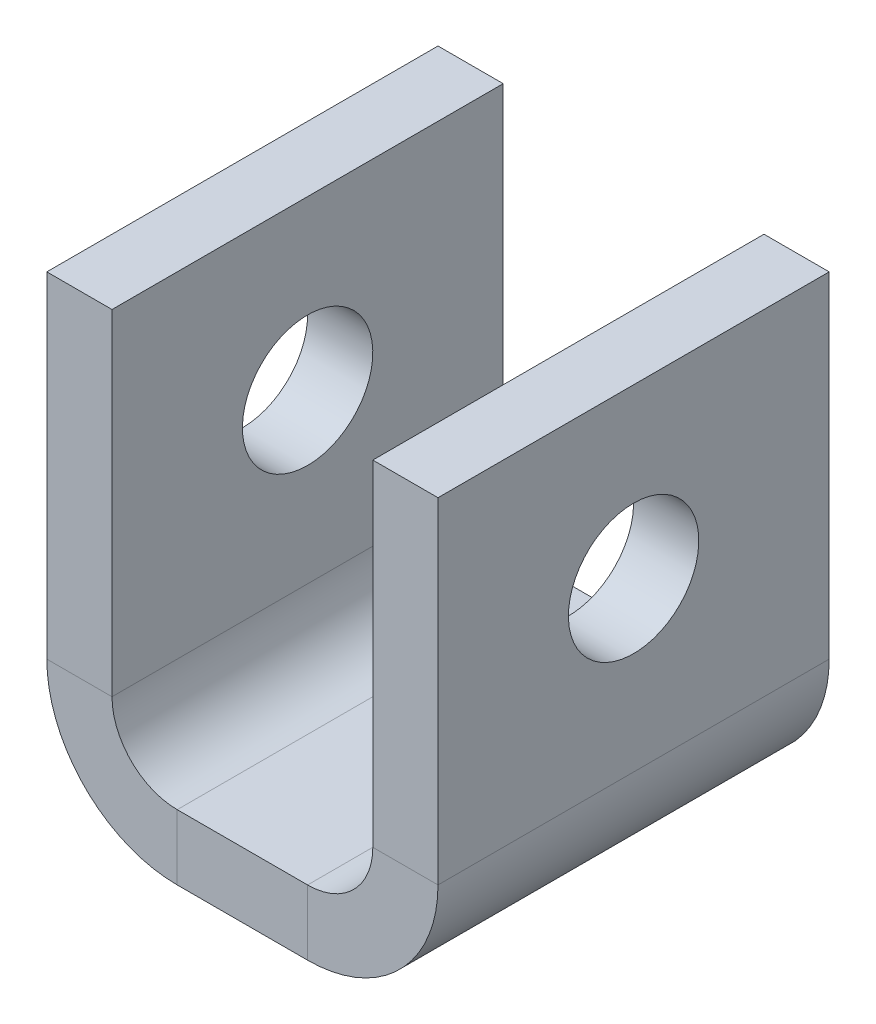
ISO-10303-21;
HEADER;
FILE_DESCRIPTION(('STEP AP214'),'2;1');
FILE_NAME('part.step','',(''),(''),'','','');
FILE_SCHEMA(('AUTOMOTIVE_DESIGN { 1 0 10303 214 1 1 1 1 }'));
ENDSEC;
DATA;
#1=APPLICATION_CONTEXT('core data for automotive mechanical design processes');
#2=APPLICATION_PROTOCOL_DEFINITION('international standard','automotive_design',2000,#1);
#3=PRODUCT_CONTEXT('',#1,'mechanical');
#4=PRODUCT('Part','Part','',(#3));
#5=PRODUCT_RELATED_PRODUCT_CATEGORY('part','',(#4));
#6=PRODUCT_DEFINITION_FORMATION('','',#4);
#7=PRODUCT_DEFINITION_CONTEXT('part definition',#1,'design');
#8=PRODUCT_DEFINITION('design','',#6,#7);
#9=PRODUCT_DEFINITION_SHAPE('','',#8);
#10=(LENGTH_UNIT() NAMED_UNIT(*) SI_UNIT(.MILLI.,.METRE.));
#11=(NAMED_UNIT(*) PLANE_ANGLE_UNIT() SI_UNIT($,.RADIAN.));
#12=(NAMED_UNIT(*) SI_UNIT($,.STERADIAN.) SOLID_ANGLE_UNIT());
#13=UNCERTAINTY_MEASURE_WITH_UNIT(LENGTH_MEASURE(1.E-05),#10,'distance_accuracy_value','');
#14=(GEOMETRIC_REPRESENTATION_CONTEXT(3) GLOBAL_UNCERTAINTY_ASSIGNED_CONTEXT((#13)) GLOBAL_UNIT_ASSIGNED_CONTEXT((#10,
#11,#12)) REPRESENTATION_CONTEXT('',''));
#15=CARTESIAN_POINT('',(0.,0.,0.));
#16=DIRECTION('',(0.,0.,1.));
#17=DIRECTION('',(1.,0.,0.));
#18=AXIS2_PLACEMENT_3D('',#15,#16,#17);
#19=CARTESIAN_POINT('',(0.,-5.,0.));
#20=DIRECTION('',(0.,-1.,0.));
#21=DIRECTION('',(0.,0.,-1.));
#22=AXIS2_PLACEMENT_3D('',#19,#20,#21);
#23=PLANE('',#22);
#24=CARTESIAN_POINT('',(0.,-5.,0.));
#25=DIRECTION('',(0.,-1.,0.));
#26=DIRECTION('',(0.,0.,-1.));
#27=AXIS2_PLACEMENT_3D('',#24,#25,#26);
#28=CIRCLE('',#27,2.5);
#29=CARTESIAN_POINT('',(0.,-5.,-2.5));
#30=VERTEX_POINT('',#29);
#31=EDGE_CURVE('E370',#30,#30,#28,.T.);
#32=ORIENTED_EDGE('',*,*,#31,.F.);
#33=EDGE_LOOP('',(#32));
#34=FACE_BOUND('',#33,.T.);
#35=DIRECTION('',(-1.,0.,0.));
#36=VECTOR('',#35,1.);
#37=CARTESIAN_POINT('',(-42.5,-5.,-15.));
#38=LINE('',#37,#36);
#39=CARTESIAN_POINT('',(5.00000000000002,-5.,-15.));
#40=VERTEX_POINT('',#39);
#41=CARTESIAN_POINT('',(-4.99999999999999,-5.,-15.));
#42=VERTEX_POINT('',#41);
#43=EDGE_CURVE('E254',#40,#42,#38,.T.);
#44=ORIENTED_EDGE('',*,*,#43,.F.);
#45=DIRECTION('',(0.,0.,1.));
#46=VECTOR('',#45,1.);
#47=CARTESIAN_POINT('',(5.00000000000002,-5.,0.));
#48=LINE('',#47,#46);
#49=CARTESIAN_POINT('',(5.00000000000002,-5.,15.));
#50=VERTEX_POINT('',#49);
#51=EDGE_CURVE('E245',#40,#50,#48,.T.);
#52=ORIENTED_EDGE('',*,*,#51,.T.);
#53=DIRECTION('',(1.,0.,0.));
#54=VECTOR('',#53,1.);
#55=CARTESIAN_POINT('',(-42.5,-5.,15.));
#56=LINE('',#55,#54);
#57=CARTESIAN_POINT('',(-4.99999999999999,-5.,15.));
#58=VERTEX_POINT('',#57);
#59=EDGE_CURVE('E237',#58,#50,#56,.T.);
#60=ORIENTED_EDGE('',*,*,#59,.F.);
#61=DIRECTION('',(0.,0.,1.));
#62=VECTOR('',#61,1.);
#63=CARTESIAN_POINT('',(-4.99999999999999,-5.,0.));
#64=LINE('',#63,#62);
#65=EDGE_CURVE('E233',#42,#58,#64,.T.);
#66=ORIENTED_EDGE('',*,*,#65,.F.);
#67=EDGE_LOOP('',(#44,#52,#60,#66));
#68=FACE_BOUND('',#67,.T.);
#69=ADVANCED_FACE('F53',(#34,#68),#23,.T.);
#70=CARTESIAN_POINT('',(-42.5,-5.,-15.));
#71=DIRECTION('',(0.,0.,-1.));
#72=DIRECTION('',(-1.,0.,0.));
#73=AXIS2_PLACEMENT_3D('',#70,#71,#72);
#74=PLANE('',#73);
#75=DIRECTION('',(-1.,0.,0.));
#76=VECTOR('',#75,1.);
#77=CARTESIAN_POINT('',(-42.5,0.,-15.));
#78=LINE('',#77,#76);
#79=CARTESIAN_POINT('',(5.00000000000001,0.,-15.));
#80=VERTEX_POINT('',#79);
#81=CARTESIAN_POINT('',(-4.99999999999999,0.,-15.));
#82=VERTEX_POINT('',#81);
#83=EDGE_CURVE('E76',#80,#82,#78,.T.);
#84=ORIENTED_EDGE('',*,*,#83,.F.);
#85=DIRECTION('',(0.,-1.,0.));
#86=VECTOR('',#85,1.);
#87=CARTESIAN_POINT('',(5.00000000000001,-5.,-15.));
#88=LINE('',#87,#86);
#89=EDGE_CURVE('E248',#80,#40,#88,.T.);
#90=ORIENTED_EDGE('',*,*,#89,.T.);
#91=ORIENTED_EDGE('',*,*,#43,.T.);
#92=DIRECTION('',(0.,-1.,0.));
#93=VECTOR('',#92,1.);
#94=CARTESIAN_POINT('',(-5.,-5.,-15.));
#95=LINE('',#94,#93);
#96=EDGE_CURVE('E242',#82,#42,#95,.T.);
#97=ORIENTED_EDGE('',*,*,#96,.F.);
#98=EDGE_LOOP('',(#84,#90,#91,#97));
#99=FACE_BOUND('',#98,.T.);
#100=ADVANCED_FACE('F297',(#99),#74,.T.);
#101=CARTESIAN_POINT('',(-42.5,-5.,15.));
#102=DIRECTION('',(0.,0.,1.));
#103=DIRECTION('',(1.,0.,0.));
#104=AXIS2_PLACEMENT_3D('',#101,#102,#103);
#105=PLANE('',#104);
#106=ORIENTED_EDGE('',*,*,#59,.T.);
#107=DIRECTION('',(0.,1.,0.));
#108=VECTOR('',#107,1.);
#109=CARTESIAN_POINT('',(5.00000000000002,-5.,15.));
#110=LINE('',#109,#108);
#111=CARTESIAN_POINT('',(5.00000000000002,0.,15.));
#112=VERTEX_POINT('',#111);
#113=EDGE_CURVE('E12',#50,#112,#110,.T.);
#114=ORIENTED_EDGE('',*,*,#113,.T.);
#115=DIRECTION('',(1.,0.,0.));
#116=VECTOR('',#115,1.);
#117=CARTESIAN_POINT('',(-42.5,0.,15.));
#118=LINE('',#117,#116);
#119=CARTESIAN_POINT('',(-4.99999999999999,0.,15.));
#120=VERTEX_POINT('',#119);
#121=EDGE_CURVE('E255',#120,#112,#118,.T.);
#122=ORIENTED_EDGE('',*,*,#121,.F.);
#123=DIRECTION('',(0.,1.,0.));
#124=VECTOR('',#123,1.);
#125=CARTESIAN_POINT('',(-4.99999999999999,-5.,15.));
#126=LINE('',#125,#124);
#127=EDGE_CURVE('E236',#58,#120,#126,.T.);
#128=ORIENTED_EDGE('',*,*,#127,.F.);
#129=EDGE_LOOP('',(#106,#114,#122,#128));
#130=FACE_BOUND('',#129,.T.);
#131=ADVANCED_FACE('F55',(#130),#105,.T.);
#132=CARTESIAN_POINT('',(0.,0.,0.));
#133=DIRECTION('',(0.,-1.,0.));
#134=DIRECTION('',(0.,0.,-1.));
#135=AXIS2_PLACEMENT_3D('',#132,#133,#134);
#136=PLANE('',#135);
#137=CARTESIAN_POINT('',(0.,0.,0.));
#138=DIRECTION('',(0.,-1.,0.));
#139=DIRECTION('',(0.,0.,-1.));
#140=AXIS2_PLACEMENT_3D('',#137,#138,#139);
#141=CIRCLE('',#140,2.5);
#142=CARTESIAN_POINT('',(0.,0.,-2.5));
#143=VERTEX_POINT('',#142);
#144=EDGE_CURVE('E57',#143,#143,#141,.T.);
#145=ORIENTED_EDGE('',*,*,#144,.T.);
#146=EDGE_LOOP('',(#145));
#147=FACE_BOUND('',#146,.T.);
#148=DIRECTION('',(0.,0.,1.));
#149=VECTOR('',#148,1.);
#150=CARTESIAN_POINT('',(5.00000000000002,0.,0.));
#151=LINE('',#150,#149);
#152=EDGE_CURVE('E62',#80,#112,#151,.T.);
#153=ORIENTED_EDGE('',*,*,#152,.F.);
#154=ORIENTED_EDGE('',*,*,#83,.T.);
#155=DIRECTION('',(0.,0.,1.));
#156=VECTOR('',#155,1.);
#157=CARTESIAN_POINT('',(-4.99999999999999,0.,0.));
#158=LINE('',#157,#156);
#159=EDGE_CURVE('E240',#82,#120,#158,.T.);
#160=ORIENTED_EDGE('',*,*,#159,.T.);
#161=ORIENTED_EDGE('',*,*,#121,.T.);
#162=EDGE_LOOP('',(#153,#154,#160,#161));
#163=FACE_BOUND('',#162,.T.);
#164=ADVANCED_FACE('F360',(#147,#163),#136,.F.);
#165=CARTESIAN_POINT('',(-5.,5.,-15.));
#166=DIRECTION('',(0.,0.,-1.));
#167=DIRECTION('',(-1.,0.,0.));
#168=AXIS2_PLACEMENT_3D('',#165,#166,#167);
#169=PLANE('',#168);
#170=DIRECTION('',(-1.,0.,0.));
#171=VECTOR('',#170,1.);
#172=CARTESIAN_POINT('',(-15.,5.00000000000003,-15.));
#173=LINE('',#172,#171);
#174=CARTESIAN_POINT('',(-9.99999999999999,5.00000000000001,-15.));
#175=VERTEX_POINT('',#174);
#176=CARTESIAN_POINT('',(-15.,5.00000000000004,-15.));
#177=VERTEX_POINT('',#176);
#178=EDGE_CURVE('E198',#175,#177,#173,.T.);
#179=ORIENTED_EDGE('',*,*,#178,.F.);
#180=CARTESIAN_POINT('',(-5.,5.,-15.));
#181=DIRECTION('',(0.,0.,-1.));
#182=DIRECTION('',(-1.,0.,0.));
#183=AXIS2_PLACEMENT_3D('',#180,#181,#182);
#184=CIRCLE('',#183,5.);
#185=EDGE_CURVE('E195',#175,#82,#184,.F.);
#186=ORIENTED_EDGE('',*,*,#185,.T.);
#187=ORIENTED_EDGE('',*,*,#96,.T.);
#188=CARTESIAN_POINT('',(-5.,5.,-15.));
#189=DIRECTION('',(0.,0.,1.));
#190=DIRECTION('',(-1.,0.,0.));
#191=AXIS2_PLACEMENT_3D('',#188,#189,#190);
#192=CIRCLE('',#191,10.);
#193=EDGE_CURVE('E222',#177,#42,#192,.T.);
#194=ORIENTED_EDGE('',*,*,#193,.F.);
#195=EDGE_LOOP('',(#179,#186,#187,#194));
#196=FACE_BOUND('',#195,.T.);
#197=ADVANCED_FACE('F327',(#196),#169,.T.);
#198=CARTESIAN_POINT('',(-4.99999999999999,5.,15.));
#199=DIRECTION('',(0.,0.,1.));
#200=DIRECTION('',(1.,0.,0.));
#201=AXIS2_PLACEMENT_3D('',#198,#199,#200);
#202=PLANE('',#201);
#203=CARTESIAN_POINT('',(-4.99999999999999,5.,15.));
#204=DIRECTION('',(0.,0.,-1.));
#205=DIRECTION('',(-1.,0.,0.));
#206=AXIS2_PLACEMENT_3D('',#203,#204,#205);
#207=CIRCLE('',#206,5.);
#208=CARTESIAN_POINT('',(-9.99999999999999,5.00000000000002,15.));
#209=VERTEX_POINT('',#208);
#210=EDGE_CURVE('E226',#120,#209,#207,.T.);
#211=ORIENTED_EDGE('',*,*,#210,.T.);
#212=DIRECTION('',(1.,0.,0.));
#213=VECTOR('',#212,1.);
#214=CARTESIAN_POINT('',(-15.,5.00000000000003,15.));
#215=LINE('',#214,#213);
#216=CARTESIAN_POINT('',(-15.,5.00000000000003,15.));
#217=VERTEX_POINT('',#216);
#218=EDGE_CURVE('E207',#217,#209,#215,.T.);
#219=ORIENTED_EDGE('',*,*,#218,.F.);
#220=CARTESIAN_POINT('',(-4.99999999999999,5.,15.));
#221=DIRECTION('',(0.,0.,-1.));
#222=DIRECTION('',(1.,0.,0.));
#223=AXIS2_PLACEMENT_3D('',#220,#221,#222);
#224=CIRCLE('',#223,10.);
#225=EDGE_CURVE('E225',#58,#217,#224,.T.);
#226=ORIENTED_EDGE('',*,*,#225,.F.);
#227=ORIENTED_EDGE('',*,*,#127,.T.);
#228=EDGE_LOOP('',(#211,#219,#226,#227));
#229=FACE_BOUND('',#228,.T.);
#230=ADVANCED_FACE('F313',(#229),#202,.T.);
#231=CARTESIAN_POINT('',(-4.99999999999999,5.,32.6158138314886));
#232=DIRECTION('',(0.,0.,-1.));
#233=DIRECTION('',(-1.,0.,0.));
#234=AXIS2_PLACEMENT_3D('',#231,#232,#233);
#235=CYLINDRICAL_SURFACE('',#234,10.);
#236=ORIENTED_EDGE('',*,*,#65,.T.);
#237=ORIENTED_EDGE('',*,*,#225,.T.);
#238=DIRECTION('',(0.,0.,1.));
#239=VECTOR('',#238,1.);
#240=CARTESIAN_POINT('',(-15.,5.00000000000003,0.));
#241=LINE('',#240,#239);
#242=EDGE_CURVE('E213',#177,#217,#241,.T.);
#243=ORIENTED_EDGE('',*,*,#242,.F.);
#244=ORIENTED_EDGE('',*,*,#193,.T.);
#245=EDGE_LOOP('',(#236,#237,#243,#244));
#246=FACE_BOUND('',#245,.T.);
#247=ADVANCED_FACE('F309',(#246),#235,.T.);
#248=CARTESIAN_POINT('',(-4.99999999999999,5.,32.6158138314886));
#249=DIRECTION('',(0.,0.,-1.));
#250=DIRECTION('',(-1.,0.,0.));
#251=AXIS2_PLACEMENT_3D('',#248,#249,#250);
#252=CYLINDRICAL_SURFACE('',#251,5.);
#253=ORIENTED_EDGE('',*,*,#159,.F.);
#254=ORIENTED_EDGE('',*,*,#185,.F.);
#255=DIRECTION('',(0.,0.,1.));
#256=VECTOR('',#255,1.);
#257=CARTESIAN_POINT('',(-9.99999999999999,5.00000000000002,0.));
#258=LINE('',#257,#256);
#259=EDGE_CURVE('E188',#175,#209,#258,.T.);
#260=ORIENTED_EDGE('',*,*,#259,.T.);
#261=ORIENTED_EDGE('',*,*,#210,.F.);
#262=EDGE_LOOP('',(#253,#254,#260,#261));
#263=FACE_BOUND('',#262,.T.);
#264=ADVANCED_FACE('F322',(#263),#252,.F.);
#265=CARTESIAN_POINT('',(-14.9999999999999,30.7190275490383,15.));
#266=DIRECTION('',(0.,1.,0.));
#267=DIRECTION('',(0.,0.,1.));
#268=AXIS2_PLACEMENT_3D('',#265,#266,#267);
#269=PLANE('',#268);
#270=DIRECTION('',(0.,0.,1.));
#271=VECTOR('',#270,1.);
#272=CARTESIAN_POINT('',(-9.9999999999999,30.7190275490383,15.));
#273=LINE('',#272,#271);
#274=CARTESIAN_POINT('',(-9.9999999999999,30.7190275490383,-15.));
#275=VERTEX_POINT('',#274);
#276=CARTESIAN_POINT('',(-9.9999999999999,30.7190275490383,15.));
#277=VERTEX_POINT('',#276);
#278=EDGE_CURVE('E202',#275,#277,#273,.T.);
#279=ORIENTED_EDGE('',*,*,#278,.F.);
#280=DIRECTION('',(1.,0.,0.));
#281=VECTOR('',#280,1.);
#282=CARTESIAN_POINT('',(-14.9999999999999,30.7190275490383,-15.));
#283=LINE('',#282,#281);
#284=CARTESIAN_POINT('',(-14.9999999999999,30.7190275490383,-15.));
#285=VERTEX_POINT('',#284);
#286=EDGE_CURVE('E192',#285,#275,#283,.T.);
#287=ORIENTED_EDGE('',*,*,#286,.F.);
#288=DIRECTION('',(0.,0.,1.));
#289=VECTOR('',#288,1.);
#290=CARTESIAN_POINT('',(-14.9999999999999,30.7190275490383,15.));
#291=LINE('',#290,#289);
#292=CARTESIAN_POINT('',(-14.9999999999999,30.7190275490383,15.));
#293=VERTEX_POINT('',#292);
#294=EDGE_CURVE('E217',#285,#293,#291,.T.);
#295=ORIENTED_EDGE('',*,*,#294,.T.);
#296=DIRECTION('',(1.,0.,0.));
#297=VECTOR('',#296,1.);
#298=CARTESIAN_POINT('',(-14.9999999999999,30.7190275490383,15.));
#299=LINE('',#298,#297);
#300=EDGE_CURVE('E215',#293,#277,#299,.T.);
#301=ORIENTED_EDGE('',*,*,#300,.T.);
#302=EDGE_LOOP('',(#279,#287,#295,#301));
#303=FACE_BOUND('',#302,.T.);
#304=ADVANCED_FACE('F337',(#303),#269,.T.);
#305=CARTESIAN_POINT('',(-15.0000000000001,-11.7809724509617,0.));
#306=DIRECTION('',(-1.,0.,0.));
#307=DIRECTION('',(0.,0.,-1.));
#308=AXIS2_PLACEMENT_3D('',#305,#306,#307);
#309=PLANE('',#308);
#310=CARTESIAN_POINT('',(-14.9999999999999,17.8595137745191,0.));
#311=DIRECTION('',(-1.,0.,0.));
#312=DIRECTION('',(0.,-1.,0.));
#313=AXIS2_PLACEMENT_3D('',#310,#311,#312);
#314=CIRCLE('',#313,5.);
#315=CARTESIAN_POINT('',(-15.,12.859513774519,0.));
#316=VERTEX_POINT('',#315);
#317=EDGE_CURVE('E262',#316,#316,#314,.F.);
#318=ORIENTED_EDGE('',*,*,#317,.T.);
#319=EDGE_LOOP('',(#318));
#320=FACE_BOUND('',#319,.T.);
#321=DIRECTION('',(0.,1.,0.));
#322=VECTOR('',#321,1.);
#323=CARTESIAN_POINT('',(-14.9999999999999,30.7190275490383,-15.));
#324=LINE('',#323,#322);
#325=EDGE_CURVE('E196',#177,#285,#324,.T.);
#326=ORIENTED_EDGE('',*,*,#325,.F.);
#327=ORIENTED_EDGE('',*,*,#242,.T.);
#328=DIRECTION('',(0.,-1.,0.));
#329=VECTOR('',#328,1.);
#330=CARTESIAN_POINT('',(-14.9999999999999,30.7190275490383,15.));
#331=LINE('',#330,#329);
#332=EDGE_CURVE('E210',#293,#217,#331,.T.);
#333=ORIENTED_EDGE('',*,*,#332,.F.);
#334=ORIENTED_EDGE('',*,*,#294,.F.);
#335=EDGE_LOOP('',(#326,#327,#333,#334));
#336=FACE_BOUND('',#335,.T.);
#337=ADVANCED_FACE('F334',(#320,#336),#309,.T.);
#338=CARTESIAN_POINT('',(-14.9999999999999,30.7190275490383,15.));
#339=DIRECTION('',(0.,0.,1.));
#340=DIRECTION('',(0.,-1.,0.));
#341=AXIS2_PLACEMENT_3D('',#338,#339,#340);
#342=PLANE('',#341);
#343=ORIENTED_EDGE('',*,*,#332,.T.);
#344=ORIENTED_EDGE('',*,*,#218,.T.);
#345=DIRECTION('',(0.,-1.,0.));
#346=VECTOR('',#345,1.);
#347=CARTESIAN_POINT('',(-9.9999999999999,30.7190275490383,15.));
#348=LINE('',#347,#346);
#349=EDGE_CURVE('E200',#277,#209,#348,.T.);
#350=ORIENTED_EDGE('',*,*,#349,.F.);
#351=ORIENTED_EDGE('',*,*,#300,.F.);
#352=EDGE_LOOP('',(#343,#344,#350,#351));
#353=FACE_BOUND('',#352,.T.);
#354=ADVANCED_FACE('F316',(#353),#342,.T.);
#355=CARTESIAN_POINT('',(-10.,-11.7809724509617,0.));
#356=DIRECTION('',(-1.,0.,0.));
#357=DIRECTION('',(0.,0.,-1.));
#358=AXIS2_PLACEMENT_3D('',#355,#356,#357);
#359=PLANE('',#358);
#360=CARTESIAN_POINT('',(-9.99999999999995,17.8595137745191,0.));
#361=DIRECTION('',(-1.,0.,0.));
#362=DIRECTION('',(0.,-1.,0.));
#363=AXIS2_PLACEMENT_3D('',#360,#361,#362);
#364=CIRCLE('',#363,5.);
#365=CARTESIAN_POINT('',(-9.99999999999996,12.8595137745191,0.));
#366=VERTEX_POINT('',#365);
#367=EDGE_CURVE('E180',#366,#366,#364,.T.);
#368=ORIENTED_EDGE('',*,*,#367,.T.);
#369=EDGE_LOOP('',(#368));
#370=FACE_BOUND('',#369,.T.);
#371=ORIENTED_EDGE('',*,*,#259,.F.);
#372=DIRECTION('',(0.,1.,0.));
#373=VECTOR('',#372,1.);
#374=CARTESIAN_POINT('',(-9.9999999999999,30.7190275490383,-15.));
#375=LINE('',#374,#373);
#376=EDGE_CURVE('E205',#175,#275,#375,.T.);
#377=ORIENTED_EDGE('',*,*,#376,.T.);
#378=ORIENTED_EDGE('',*,*,#278,.T.);
#379=ORIENTED_EDGE('',*,*,#349,.T.);
#380=EDGE_LOOP('',(#371,#377,#378,#379));
#381=FACE_BOUND('',#380,.T.);
#382=ADVANCED_FACE('F325',(#370,#381),#359,.F.);
#383=CARTESIAN_POINT('',(-14.9999999999999,30.7190275490383,-15.));
#384=DIRECTION('',(0.,0.,-1.));
#385=DIRECTION('',(0.,1.,0.));
#386=AXIS2_PLACEMENT_3D('',#383,#384,#385);
#387=PLANE('',#386);
#388=ORIENTED_EDGE('',*,*,#376,.F.);
#389=ORIENTED_EDGE('',*,*,#178,.T.);
#390=ORIENTED_EDGE('',*,*,#325,.T.);
#391=ORIENTED_EDGE('',*,*,#286,.T.);
#392=EDGE_LOOP('',(#388,#389,#390,#391));
#393=FACE_BOUND('',#392,.T.);
#394=ADVANCED_FACE('F330',(#393),#387,.T.);
#395=CARTESIAN_POINT('',(5.00000000000001,5.,-15.));
#396=DIRECTION('',(0.,0.,-1.));
#397=DIRECTION('',(-1.,0.,0.));
#398=AXIS2_PLACEMENT_3D('',#395,#396,#397);
#399=PLANE('',#398);
#400=ORIENTED_EDGE('',*,*,#89,.F.);
#401=CARTESIAN_POINT('',(5.00000000000001,5.,-15.));
#402=DIRECTION('',(0.,0.,1.));
#403=DIRECTION('',(1.,0.,0.));
#404=AXIS2_PLACEMENT_3D('',#401,#402,#403);
#405=CIRCLE('',#404,5.);
#406=CARTESIAN_POINT('',(10.,5.00000000000002,-15.));
#407=VERTEX_POINT('',#406);
#408=EDGE_CURVE('E163',#80,#407,#405,.T.);
#409=ORIENTED_EDGE('',*,*,#408,.T.);
#410=DIRECTION('',(1.,0.,0.));
#411=VECTOR('',#410,1.);
#412=CARTESIAN_POINT('',(15.,5.00000000000003,-15.));
#413=LINE('',#412,#411);
#414=CARTESIAN_POINT('',(15.,5.00000000000004,-15.));
#415=VERTEX_POINT('',#414);
#416=EDGE_CURVE('E170',#407,#415,#413,.T.);
#417=ORIENTED_EDGE('',*,*,#416,.T.);
#418=CARTESIAN_POINT('',(5.00000000000001,5.,-15.));
#419=DIRECTION('',(0.,0.,1.));
#420=DIRECTION('',(-1.,0.,0.));
#421=AXIS2_PLACEMENT_3D('',#418,#419,#420);
#422=CIRCLE('',#421,10.);
#423=EDGE_CURVE('E181',#40,#415,#422,.T.);
#424=ORIENTED_EDGE('',*,*,#423,.F.);
#425=EDGE_LOOP('',(#400,#409,#417,#424));
#426=FACE_BOUND('',#425,.T.);
#427=ADVANCED_FACE('F289',(#426),#399,.T.);
#428=CARTESIAN_POINT('',(5.00000000000002,5.,15.));
#429=DIRECTION('',(0.,0.,1.));
#430=DIRECTION('',(1.,0.,0.));
#431=AXIS2_PLACEMENT_3D('',#428,#429,#430);
#432=PLANE('',#431);
#433=DIRECTION('',(-1.,0.,0.));
#434=VECTOR('',#433,1.);
#435=CARTESIAN_POINT('',(15.,5.00000000000003,15.));
#436=LINE('',#435,#434);
#437=CARTESIAN_POINT('',(15.,5.00000000000003,15.));
#438=VERTEX_POINT('',#437);
#439=CARTESIAN_POINT('',(10.,5.00000000000002,15.));
#440=VERTEX_POINT('',#439);
#441=EDGE_CURVE('E152',#438,#440,#436,.T.);
#442=ORIENTED_EDGE('',*,*,#441,.T.);
#443=CARTESIAN_POINT('',(5.00000000000002,5.,15.));
#444=DIRECTION('',(0.,0.,1.));
#445=DIRECTION('',(1.,0.,0.));
#446=AXIS2_PLACEMENT_3D('',#443,#444,#445);
#447=CIRCLE('',#446,5.);
#448=EDGE_CURVE('E185',#440,#112,#447,.F.);
#449=ORIENTED_EDGE('',*,*,#448,.T.);
#450=ORIENTED_EDGE('',*,*,#113,.F.);
#451=CARTESIAN_POINT('',(5.00000000000002,5.,15.));
#452=DIRECTION('',(0.,0.,-1.));
#453=DIRECTION('',(1.,0.,0.));
#454=AXIS2_PLACEMENT_3D('',#451,#452,#453);
#455=CIRCLE('',#454,10.);
#456=EDGE_CURVE('E184',#438,#50,#455,.T.);
#457=ORIENTED_EDGE('',*,*,#456,.F.);
#458=EDGE_LOOP('',(#442,#449,#450,#457));
#459=FACE_BOUND('',#458,.T.);
#460=ADVANCED_FACE('F302',(#459),#432,.T.);
#461=CARTESIAN_POINT('',(5.00000000000001,5.,-32.6158138314885));
#462=DIRECTION('',(0.,0.,1.));
#463=DIRECTION('',(1.,0.,0.));
#464=AXIS2_PLACEMENT_3D('',#461,#462,#463);
#465=CYLINDRICAL_SURFACE('',#464,10.);
#466=ORIENTED_EDGE('',*,*,#456,.T.);
#467=ORIENTED_EDGE('',*,*,#51,.F.);
#468=ORIENTED_EDGE('',*,*,#423,.T.);
#469=DIRECTION('',(0.,0.,1.));
#470=VECTOR('',#469,1.);
#471=CARTESIAN_POINT('',(15.,5.00000000000004,0.));
#472=LINE('',#471,#470);
#473=EDGE_CURVE('E178',#415,#438,#472,.T.);
#474=ORIENTED_EDGE('',*,*,#473,.T.);
#475=EDGE_LOOP('',(#466,#467,#468,#474));
#476=FACE_BOUND('',#475,.T.);
#477=ADVANCED_FACE('F292',(#476),#465,.T.);
#478=CARTESIAN_POINT('',(5.00000000000001,5.,-32.6158138314885));
#479=DIRECTION('',(0.,0.,1.));
#480=DIRECTION('',(1.,0.,0.));
#481=AXIS2_PLACEMENT_3D('',#478,#479,#480);
#482=CYLINDRICAL_SURFACE('',#481,5.);
#483=ORIENTED_EDGE('',*,*,#448,.F.);
#484=DIRECTION('',(0.,0.,1.));
#485=VECTOR('',#484,1.);
#486=CARTESIAN_POINT('',(10.,5.00000000000002,0.));
#487=LINE('',#486,#485);
#488=EDGE_CURVE('E279',#407,#440,#487,.T.);
#489=ORIENTED_EDGE('',*,*,#488,.F.);
#490=ORIENTED_EDGE('',*,*,#408,.F.);
#491=ORIENTED_EDGE('',*,*,#152,.T.);
#492=EDGE_LOOP('',(#483,#489,#490,#491));
#493=FACE_BOUND('',#492,.T.);
#494=ADVANCED_FACE('F298',(#493),#482,.F.);
#495=CARTESIAN_POINT('',(14.9999999999999,30.7190275490383,15.));
#496=DIRECTION('',(0.,1.,0.));
#497=DIRECTION('',(0.,0.,-1.));
#498=AXIS2_PLACEMENT_3D('',#495,#496,#497);
#499=PLANE('',#498);
#500=DIRECTION('',(0.,0.,-1.));
#501=VECTOR('',#500,1.);
#502=CARTESIAN_POINT('',(9.99999999999992,30.7190275490383,15.));
#503=LINE('',#502,#501);
#504=CARTESIAN_POINT('',(9.99999999999992,30.7190275490383,15.));
#505=VERTEX_POINT('',#504);
#506=CARTESIAN_POINT('',(9.99999999999991,30.7190275490383,-15.));
#507=VERTEX_POINT('',#506);
#508=EDGE_CURVE('E156',#505,#507,#503,.T.);
#509=ORIENTED_EDGE('',*,*,#508,.F.);
#510=DIRECTION('',(-1.,0.,0.));
#511=VECTOR('',#510,1.);
#512=CARTESIAN_POINT('',(14.9999999999999,30.7190275490383,15.));
#513=LINE('',#512,#511);
#514=CARTESIAN_POINT('',(14.9999999999999,30.7190275490383,15.));
#515=VERTEX_POINT('',#514);
#516=EDGE_CURVE('E149',#515,#505,#513,.T.);
#517=ORIENTED_EDGE('',*,*,#516,.F.);
#518=DIRECTION('',(0.,0.,-1.));
#519=VECTOR('',#518,1.);
#520=CARTESIAN_POINT('',(14.9999999999999,30.7190275490383,15.));
#521=LINE('',#520,#519);
#522=CARTESIAN_POINT('',(14.9999999999999,30.7190275490383,-15.));
#523=VERTEX_POINT('',#522);
#524=EDGE_CURVE('E161',#515,#523,#521,.T.);
#525=ORIENTED_EDGE('',*,*,#524,.T.);
#526=DIRECTION('',(-1.,0.,0.));
#527=VECTOR('',#526,1.);
#528=CARTESIAN_POINT('',(14.9999999999999,30.7190275490383,-15.));
#529=LINE('',#528,#527);
#530=EDGE_CURVE('E169',#523,#507,#529,.T.);
#531=ORIENTED_EDGE('',*,*,#530,.T.);
#532=EDGE_LOOP('',(#509,#517,#525,#531));
#533=FACE_BOUND('',#532,.T.);
#534=ADVANCED_FACE('F160',(#533),#499,.T.);
#535=CARTESIAN_POINT('',(15.0000000000001,-11.7809724509617,0.));
#536=DIRECTION('',(1.,0.,0.));
#537=DIRECTION('',(0.,0.,-1.));
#538=AXIS2_PLACEMENT_3D('',#535,#536,#537);
#539=PLANE('',#538);
#540=CARTESIAN_POINT('',(15.,17.8595137745192,0.));
#541=DIRECTION('',(1.,0.,0.));
#542=DIRECTION('',(0.,1.,0.));
#543=AXIS2_PLACEMENT_3D('',#540,#541,#542);
#544=CIRCLE('',#543,5.);
#545=CARTESIAN_POINT('',(14.9999999999999,22.8595137745192,0.));
#546=VERTEX_POINT('',#545);
#547=EDGE_CURVE('E268',#546,#546,#544,.T.);
#548=ORIENTED_EDGE('',*,*,#547,.F.);
#549=EDGE_LOOP('',(#548));
#550=FACE_BOUND('',#549,.T.);
#551=ORIENTED_EDGE('',*,*,#473,.F.);
#552=DIRECTION('',(0.,-1.,0.));
#553=VECTOR('',#552,1.);
#554=CARTESIAN_POINT('',(15.0000000000002,-54.2809724509617,-15.));
#555=LINE('',#554,#553);
#556=EDGE_CURVE('E168',#523,#415,#555,.T.);
#557=ORIENTED_EDGE('',*,*,#556,.F.);
#558=ORIENTED_EDGE('',*,*,#524,.F.);
#559=DIRECTION('',(0.,1.,0.));
#560=VECTOR('',#559,1.);
#561=CARTESIAN_POINT('',(15.0000000000002,-54.2809724509617,15.));
#562=LINE('',#561,#560);
#563=EDGE_CURVE('E146',#438,#515,#562,.T.);
#564=ORIENTED_EDGE('',*,*,#563,.F.);
#565=EDGE_LOOP('',(#551,#557,#558,#564));
#566=FACE_BOUND('',#565,.T.);
#567=ADVANCED_FACE('F166',(#550,#566),#539,.T.);
#568=CARTESIAN_POINT('',(15.0000000000002,-54.2809724509617,-15.));
#569=DIRECTION('',(0.,0.,-1.));
#570=DIRECTION('',(0.,-1.,0.));
#571=AXIS2_PLACEMENT_3D('',#568,#569,#570);
#572=PLANE('',#571);
#573=ORIENTED_EDGE('',*,*,#416,.F.);
#574=DIRECTION('',(0.,-1.,0.));
#575=VECTOR('',#574,1.);
#576=CARTESIAN_POINT('',(10.0000000000002,-54.2809724509617,-15.));
#577=LINE('',#576,#575);
#578=EDGE_CURVE('E282',#507,#407,#577,.T.);
#579=ORIENTED_EDGE('',*,*,#578,.F.);
#580=ORIENTED_EDGE('',*,*,#530,.F.);
#581=ORIENTED_EDGE('',*,*,#556,.T.);
#582=EDGE_LOOP('',(#573,#579,#580,#581));
#583=FACE_BOUND('',#582,.T.);
#584=ADVANCED_FACE('F285',(#583),#572,.T.);
#585=CARTESIAN_POINT('',(10.0000000000001,-11.7809724509617,0.));
#586=DIRECTION('',(1.,0.,0.));
#587=DIRECTION('',(0.,0.,-1.));
#588=AXIS2_PLACEMENT_3D('',#585,#586,#587);
#589=PLANE('',#588);
#590=CARTESIAN_POINT('',(9.99999999999996,17.8595137745191,0.));
#591=DIRECTION('',(1.,0.,0.));
#592=DIRECTION('',(0.,1.,0.));
#593=AXIS2_PLACEMENT_3D('',#590,#591,#592);
#594=CIRCLE('',#593,5.);
#595=CARTESIAN_POINT('',(9.99999999999994,22.8595137745191,0.));
#596=VERTEX_POINT('',#595);
#597=EDGE_CURVE('E260',#596,#596,#594,.T.);
#598=ORIENTED_EDGE('',*,*,#597,.T.);
#599=EDGE_LOOP('',(#598));
#600=FACE_BOUND('',#599,.T.);
#601=ORIENTED_EDGE('',*,*,#578,.T.);
#602=ORIENTED_EDGE('',*,*,#488,.T.);
#603=DIRECTION('',(0.,1.,0.));
#604=VECTOR('',#603,1.);
#605=CARTESIAN_POINT('',(10.0000000000002,-54.2809724509617,15.));
#606=LINE('',#605,#604);
#607=EDGE_CURVE('E277',#440,#505,#606,.T.);
#608=ORIENTED_EDGE('',*,*,#607,.T.);
#609=ORIENTED_EDGE('',*,*,#508,.T.);
#610=EDGE_LOOP('',(#601,#602,#608,#609));
#611=FACE_BOUND('',#610,.T.);
#612=ADVANCED_FACE('F300',(#600,#611),#589,.F.);
#613=CARTESIAN_POINT('',(15.0000000000002,-54.2809724509617,15.));
#614=DIRECTION('',(0.,0.,1.));
#615=DIRECTION('',(0.,1.,0.));
#616=AXIS2_PLACEMENT_3D('',#613,#614,#615);
#617=PLANE('',#616);
#618=ORIENTED_EDGE('',*,*,#441,.F.);
#619=ORIENTED_EDGE('',*,*,#563,.T.);
#620=ORIENTED_EDGE('',*,*,#516,.T.);
#621=ORIENTED_EDGE('',*,*,#607,.F.);
#622=EDGE_LOOP('',(#618,#619,#620,#621));
#623=FACE_BOUND('',#622,.T.);
#624=ADVANCED_FACE('F148',(#623),#617,.T.);
#625=CARTESIAN_POINT('',(-29.1421356237309,17.859513774519,0.));
#626=DIRECTION('',(1.,0.,0.));
#627=DIRECTION('',(0.,1.,0.));
#628=AXIS2_PLACEMENT_3D('',#625,#626,#627);
#629=CYLINDRICAL_SURFACE('',#628,5.);
#630=ORIENTED_EDGE('',*,*,#547,.T.);
#631=EDGE_LOOP('',(#630));
#632=FACE_BOUND('',#631,.T.);
#633=ORIENTED_EDGE('',*,*,#597,.F.);
#634=EDGE_LOOP('',(#633));
#635=FACE_BOUND('',#634,.T.);
#636=ADVANCED_FACE('F378',(#632,#635),#629,.F.);
#637=ORIENTED_EDGE('',*,*,#317,.F.);
#638=EDGE_LOOP('',(#637));
#639=FACE_BOUND('',#638,.T.);
#640=ORIENTED_EDGE('',*,*,#367,.F.);
#641=EDGE_LOOP('',(#640));
#642=FACE_BOUND('',#641,.T.);
#643=ADVANCED_FACE('F374',(#639,#642),#629,.F.);
#644=CARTESIAN_POINT('',(0.,30.7190275490383,0.));
#645=DIRECTION('',(0.,-1.,0.));
#646=DIRECTION('',(0.,0.,-1.));
#647=AXIS2_PLACEMENT_3D('',#644,#645,#646);
#648=CYLINDRICAL_SURFACE('',#647,2.5);
#649=ORIENTED_EDGE('',*,*,#31,.T.);
#650=EDGE_LOOP('',(#649));
#651=FACE_BOUND('',#650,.T.);
#652=ORIENTED_EDGE('',*,*,#144,.F.);
#653=EDGE_LOOP('',(#652));
#654=FACE_BOUND('',#653,.T.);
#655=ADVANCED_FACE('F373',(#651,#654),#648,.F.);
#656=CLOSED_SHELL('',(#69,#100,#131,#164,#197,#230,#247,#264,#304,#337,#354,#382,#394,#427,#460,
#477,#494,#534,#567,#584,#612,#624,#636,#643,#655));
#657=MANIFOLD_SOLID_BREP('B2',#656);
#658=ADVANCED_BREP_SHAPE_REPRESENTATION('',(#18,#657),#14);
#659=SHAPE_DEFINITION_REPRESENTATION(#9,#658);
ENDSEC;
END-ISO-10303-21;
